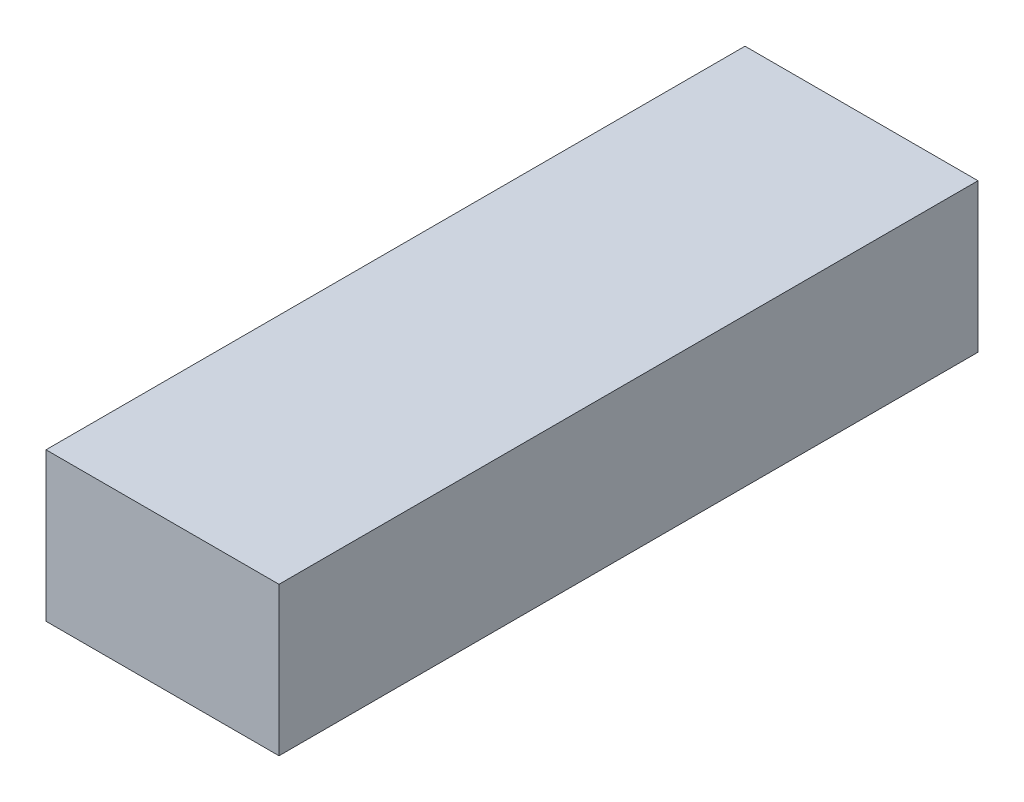
ISO-10303-21;
HEADER;
FILE_DESCRIPTION(('STEP AP214'),'2;1');
FILE_NAME('part.step','',(''),(''),'','','');
FILE_SCHEMA(('AUTOMOTIVE_DESIGN { 1 0 10303 214 1 1 1 1 }'));
ENDSEC;
DATA;
#1=APPLICATION_CONTEXT('core data for automotive mechanical design processes');
#2=APPLICATION_PROTOCOL_DEFINITION('international standard','automotive_design',2000,#1);
#3=PRODUCT_CONTEXT('',#1,'mechanical');
#4=PRODUCT('Part','Part','',(#3));
#5=PRODUCT_RELATED_PRODUCT_CATEGORY('part','',(#4));
#6=PRODUCT_DEFINITION_FORMATION('','',#4);
#7=PRODUCT_DEFINITION_CONTEXT('part definition',#1,'design');
#8=PRODUCT_DEFINITION('design','',#6,#7);
#9=PRODUCT_DEFINITION_SHAPE('','',#8);
#10=(LENGTH_UNIT() NAMED_UNIT(*) SI_UNIT(.MILLI.,.METRE.));
#11=(NAMED_UNIT(*) PLANE_ANGLE_UNIT() SI_UNIT($,.RADIAN.));
#12=(NAMED_UNIT(*) SI_UNIT($,.STERADIAN.) SOLID_ANGLE_UNIT());
#13=UNCERTAINTY_MEASURE_WITH_UNIT(LENGTH_MEASURE(1.E-05),#10,'distance_accuracy_value','');
#14=(GEOMETRIC_REPRESENTATION_CONTEXT(3) GLOBAL_UNCERTAINTY_ASSIGNED_CONTEXT((#13)) GLOBAL_UNIT_ASSIGNED_CONTEXT((#10,
#11,#12)) REPRESENTATION_CONTEXT('',''));
#15=CARTESIAN_POINT('',(0.,0.,0.));
#16=DIRECTION('',(0.,0.,1.));
#17=DIRECTION('',(1.,0.,0.));
#18=AXIS2_PLACEMENT_3D('',#15,#16,#17);
#19=CARTESIAN_POINT('',(0.,0.,120.));
#20=DIRECTION('',(1.,0.,0.));
#21=DIRECTION('',(0.,0.,-1.));
#22=AXIS2_PLACEMENT_3D('',#19,#20,#21);
#23=PLANE('',#22);
#24=DIRECTION('',(0.,-1.,0.));
#25=VECTOR('',#24,1.);
#26=CARTESIAN_POINT('',(0.,0.,0.));
#27=LINE('',#26,#25);
#28=CARTESIAN_POINT('',(0.,25.5,0.));
#29=VERTEX_POINT('',#28);
#30=CARTESIAN_POINT('',(0.,0.,0.));
#31=VERTEX_POINT('',#30);
#32=EDGE_CURVE('E98',#29,#31,#27,.T.);
#33=ORIENTED_EDGE('',*,*,#32,.T.);
#34=DIRECTION('',(0.,0.,-1.));
#35=VECTOR('',#34,1.);
#36=CARTESIAN_POINT('',(0.,0.,120.));
#37=LINE('',#36,#35);
#38=CARTESIAN_POINT('',(0.,0.,120.));
#39=VERTEX_POINT('',#38);
#40=EDGE_CURVE('E11',#39,#31,#37,.T.);
#41=ORIENTED_EDGE('',*,*,#40,.F.);
#42=DIRECTION('',(0.,-1.,0.));
#43=VECTOR('',#42,1.);
#44=CARTESIAN_POINT('',(0.,0.,120.));
#45=LINE('',#44,#43);
#46=CARTESIAN_POINT('',(0.,25.5,120.));
#47=VERTEX_POINT('',#46);
#48=EDGE_CURVE('E86',#47,#39,#45,.T.);
#49=ORIENTED_EDGE('',*,*,#48,.F.);
#50=DIRECTION('',(0.,0.,-1.));
#51=VECTOR('',#50,1.);
#52=CARTESIAN_POINT('',(0.,25.5,120.));
#53=LINE('',#52,#51);
#54=EDGE_CURVE('E94',#47,#29,#53,.T.);
#55=ORIENTED_EDGE('',*,*,#54,.T.);
#56=EDGE_LOOP('',(#33,#41,#49,#55));
#57=FACE_BOUND('',#56,.T.);
#58=ADVANCED_FACE('F35',(#57),#23,.F.);
#59=CARTESIAN_POINT('',(0.,0.,120.));
#60=DIRECTION('',(0.,1.,0.));
#61=DIRECTION('',(0.,0.,1.));
#62=AXIS2_PLACEMENT_3D('',#59,#60,#61);
#63=PLANE('',#62);
#64=DIRECTION('',(1.,0.,0.));
#65=VECTOR('',#64,1.);
#66=CARTESIAN_POINT('',(0.,0.,0.));
#67=LINE('',#66,#65);
#68=CARTESIAN_POINT('',(40.,0.,0.));
#69=VERTEX_POINT('',#68);
#70=EDGE_CURVE('E90',#31,#69,#67,.T.);
#71=ORIENTED_EDGE('',*,*,#70,.T.);
#72=DIRECTION('',(0.,0.,-1.));
#73=VECTOR('',#72,1.);
#74=CARTESIAN_POINT('',(40.,0.,120.));
#75=LINE('',#74,#73);
#76=CARTESIAN_POINT('',(40.,0.,120.));
#77=VERTEX_POINT('',#76);
#78=EDGE_CURVE('E43',#77,#69,#75,.T.);
#79=ORIENTED_EDGE('',*,*,#78,.F.);
#80=DIRECTION('',(1.,0.,0.));
#81=VECTOR('',#80,1.);
#82=CARTESIAN_POINT('',(0.,0.,120.));
#83=LINE('',#82,#81);
#84=EDGE_CURVE('E81',#39,#77,#83,.T.);
#85=ORIENTED_EDGE('',*,*,#84,.F.);
#86=ORIENTED_EDGE('',*,*,#40,.T.);
#87=EDGE_LOOP('',(#71,#79,#85,#86));
#88=FACE_BOUND('',#87,.T.);
#89=ADVANCED_FACE('F89',(#88),#63,.F.);
#90=CARTESIAN_POINT('',(40.,0.,120.));
#91=DIRECTION('',(-1.,0.,0.));
#92=DIRECTION('',(0.,0.,1.));
#93=AXIS2_PLACEMENT_3D('',#90,#91,#92);
#94=PLANE('',#93);
#95=DIRECTION('',(0.,1.,0.));
#96=VECTOR('',#95,1.);
#97=CARTESIAN_POINT('',(40.,0.,0.));
#98=LINE('',#97,#96);
#99=CARTESIAN_POINT('',(40.,25.5,0.));
#100=VERTEX_POINT('',#99);
#101=EDGE_CURVE('E68',#69,#100,#98,.T.);
#102=ORIENTED_EDGE('',*,*,#101,.T.);
#103=DIRECTION('',(0.,0.,-1.));
#104=VECTOR('',#103,1.);
#105=CARTESIAN_POINT('',(40.,25.5,120.));
#106=LINE('',#105,#104);
#107=CARTESIAN_POINT('',(40.,25.5,120.));
#108=VERTEX_POINT('',#107);
#109=EDGE_CURVE('E91',#108,#100,#106,.T.);
#110=ORIENTED_EDGE('',*,*,#109,.F.);
#111=DIRECTION('',(0.,1.,0.));
#112=VECTOR('',#111,1.);
#113=CARTESIAN_POINT('',(40.,0.,120.));
#114=LINE('',#113,#112);
#115=EDGE_CURVE('E84',#77,#108,#114,.T.);
#116=ORIENTED_EDGE('',*,*,#115,.F.);
#117=ORIENTED_EDGE('',*,*,#78,.T.);
#118=EDGE_LOOP('',(#102,#110,#116,#117));
#119=FACE_BOUND('',#118,.T.);
#120=ADVANCED_FACE('F92',(#119),#94,.F.);
#121=CARTESIAN_POINT('',(0.,25.5,120.));
#122=DIRECTION('',(0.,-1.,0.));
#123=DIRECTION('',(0.,0.,-1.));
#124=AXIS2_PLACEMENT_3D('',#121,#122,#123);
#125=PLANE('',#124);
#126=DIRECTION('',(-1.,0.,0.));
#127=VECTOR('',#126,1.);
#128=CARTESIAN_POINT('',(0.,25.5,0.));
#129=LINE('',#128,#127);
#130=EDGE_CURVE('E74',#100,#29,#129,.T.);
#131=ORIENTED_EDGE('',*,*,#130,.T.);
#132=ORIENTED_EDGE('',*,*,#54,.F.);
#133=DIRECTION('',(-1.,0.,0.));
#134=VECTOR('',#133,1.);
#135=CARTESIAN_POINT('',(0.,25.5,120.));
#136=LINE('',#135,#134);
#137=EDGE_CURVE('E51',#108,#47,#136,.T.);
#138=ORIENTED_EDGE('',*,*,#137,.F.);
#139=ORIENTED_EDGE('',*,*,#109,.T.);
#140=EDGE_LOOP('',(#131,#132,#138,#139));
#141=FACE_BOUND('',#140,.T.);
#142=ADVANCED_FACE('F105',(#141),#125,.F.);
#143=CARTESIAN_POINT('',(0.,0.,120.));
#144=DIRECTION('',(0.,0.,-1.));
#145=DIRECTION('',(-1.,0.,0.));
#146=AXIS2_PLACEMENT_3D('',#143,#144,#145);
#147=PLANE('',#146);
#148=ORIENTED_EDGE('',*,*,#48,.T.);
#149=ORIENTED_EDGE('',*,*,#84,.T.);
#150=ORIENTED_EDGE('',*,*,#115,.T.);
#151=ORIENTED_EDGE('',*,*,#137,.T.);
#152=EDGE_LOOP('',(#148,#149,#150,#151));
#153=FACE_BOUND('',#152,.T.);
#154=ADVANCED_FACE('F82',(#153),#147,.F.);
#155=CARTESIAN_POINT('',(0.,0.,0.));
#156=DIRECTION('',(0.,0.,-1.));
#157=DIRECTION('',(-1.,0.,0.));
#158=AXIS2_PLACEMENT_3D('',#155,#156,#157);
#159=PLANE('',#158);
#160=ORIENTED_EDGE('',*,*,#32,.F.);
#161=ORIENTED_EDGE('',*,*,#130,.F.);
#162=ORIENTED_EDGE('',*,*,#101,.F.);
#163=ORIENTED_EDGE('',*,*,#70,.F.);
#164=EDGE_LOOP('',(#160,#161,#162,#163));
#165=FACE_BOUND('',#164,.T.);
#166=ADVANCED_FACE('F108',(#165),#159,.T.);
#167=CLOSED_SHELL('',(#58,#89,#120,#142,#154,#166));
#168=MANIFOLD_SOLID_BREP('B2',#167);
#169=ADVANCED_BREP_SHAPE_REPRESENTATION('',(#18,#168),#14);
#170=SHAPE_DEFINITION_REPRESENTATION(#9,#169);
ENDSEC;
END-ISO-10303-21;
